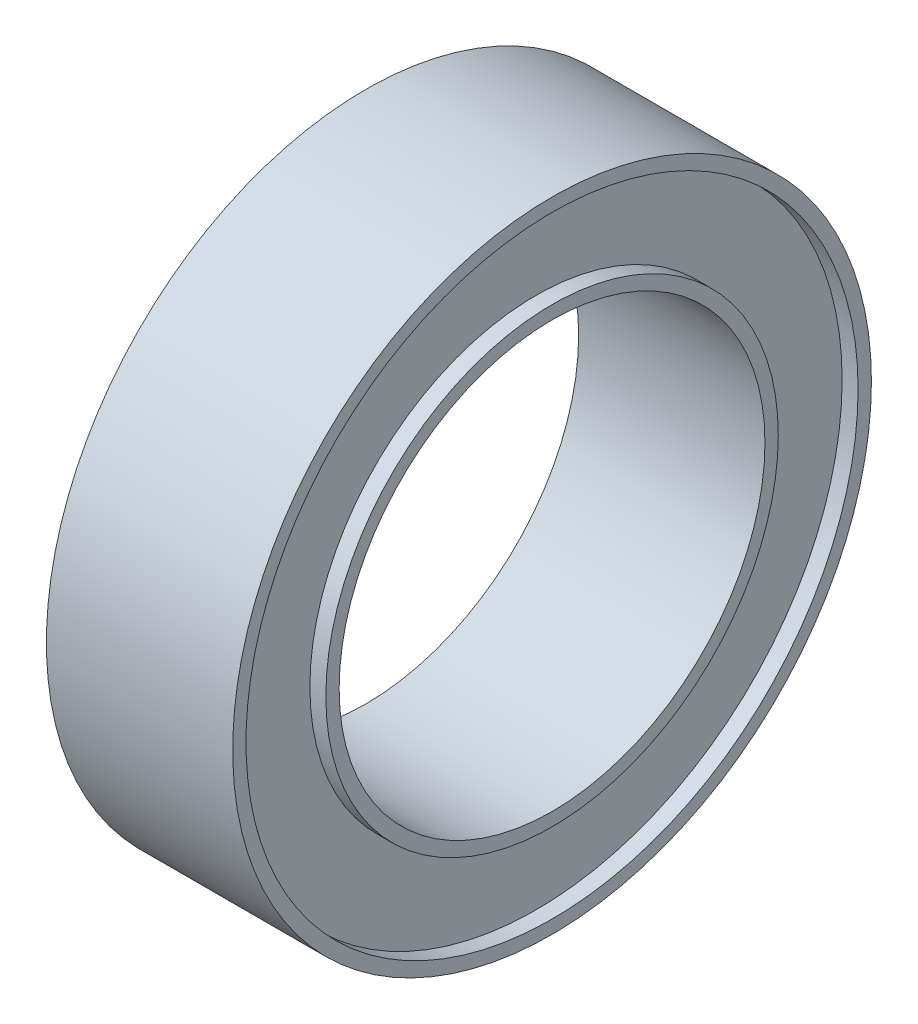
ISO-10303-21;
HEADER;
FILE_DESCRIPTION(('STEP AP214'),'2;1');
FILE_NAME('part.step','',(''),(''),'','','');
FILE_SCHEMA(('AUTOMOTIVE_DESIGN { 1 0 10303 214 1 1 1 1 }'));
ENDSEC;
DATA;
#1=APPLICATION_CONTEXT('core data for automotive mechanical design processes');
#2=APPLICATION_PROTOCOL_DEFINITION('international standard','automotive_design',2000,#1);
#3=PRODUCT_CONTEXT('',#1,'mechanical');
#4=PRODUCT('Part','Part','',(#3));
#5=PRODUCT_RELATED_PRODUCT_CATEGORY('part','',(#4));
#6=PRODUCT_DEFINITION_FORMATION('','',#4);
#7=PRODUCT_DEFINITION_CONTEXT('part definition',#1,'design');
#8=PRODUCT_DEFINITION('design','',#6,#7);
#9=PRODUCT_DEFINITION_SHAPE('','',#8);
#10=(LENGTH_UNIT() NAMED_UNIT(*) SI_UNIT(.MILLI.,.METRE.));
#11=(NAMED_UNIT(*) PLANE_ANGLE_UNIT() SI_UNIT($,.RADIAN.));
#12=(NAMED_UNIT(*) SI_UNIT($,.STERADIAN.) SOLID_ANGLE_UNIT());
#13=UNCERTAINTY_MEASURE_WITH_UNIT(LENGTH_MEASURE(1.E-05),#10,'distance_accuracy_value','');
#14=(GEOMETRIC_REPRESENTATION_CONTEXT(3) GLOBAL_UNCERTAINTY_ASSIGNED_CONTEXT((#13)) GLOBAL_UNIT_ASSIGNED_CONTEXT((#10,
#11,#12)) REPRESENTATION_CONTEXT('',''));
#15=CARTESIAN_POINT('',(0.,0.,0.));
#16=DIRECTION('',(0.,0.,1.));
#17=DIRECTION('',(1.,0.,0.));
#18=AXIS2_PLACEMENT_3D('',#15,#16,#17);
#19=CARTESIAN_POINT('',(-1.75,0.,0.));
#20=DIRECTION('',(1.,0.,0.));
#21=DIRECTION('',(0.,0.,-1.));
#22=AXIS2_PLACEMENT_3D('',#19,#20,#21);
#23=PLANE('',#22);
#24=CARTESIAN_POINT('',(-1.75,0.,0.));
#25=DIRECTION('',(1.,0.,0.));
#26=DIRECTION('',(0.,0.,-1.));
#27=AXIS2_PLACEMENT_3D('',#24,#25,#26);
#28=CIRCLE('',#27,4.);
#29=CARTESIAN_POINT('',(-1.75,0.,-4.));
#30=VERTEX_POINT('',#29);
#31=EDGE_CURVE('E44',#30,#30,#28,.F.);
#32=ORIENTED_EDGE('',*,*,#31,.F.);
#33=EDGE_LOOP('',(#32));
#34=FACE_BOUND('',#33,.T.);
#35=CARTESIAN_POINT('',(-1.75,0.,0.));
#36=DIRECTION('',(1.,0.,0.));
#37=DIRECTION('',(0.,0.,-1.));
#38=AXIS2_PLACEMENT_3D('',#35,#36,#37);
#39=CIRCLE('',#38,4.25);
#40=CARTESIAN_POINT('',(-1.75,0.,-4.25));
#41=VERTEX_POINT('',#40);
#42=EDGE_CURVE('E70',#41,#41,#39,.T.);
#43=ORIENTED_EDGE('',*,*,#42,.F.);
#44=EDGE_LOOP('',(#43));
#45=FACE_BOUND('',#44,.T.);
#46=ADVANCED_FACE('F33',(#34,#45),#23,.F.);
#47=CARTESIAN_POINT('',(1.75,0.,0.));
#48=DIRECTION('',(1.,0.,0.));
#49=DIRECTION('',(0.,0.,-1.));
#50=AXIS2_PLACEMENT_3D('',#47,#48,#49);
#51=PLANE('',#50);
#52=CARTESIAN_POINT('',(1.75,0.,0.));
#53=DIRECTION('',(1.,0.,0.));
#54=DIRECTION('',(0.,0.,-1.));
#55=AXIS2_PLACEMENT_3D('',#52,#53,#54);
#56=CIRCLE('',#55,4.);
#57=CARTESIAN_POINT('',(1.75,0.,-4.));
#58=VERTEX_POINT('',#57);
#59=EDGE_CURVE('E48',#58,#58,#56,.T.);
#60=ORIENTED_EDGE('',*,*,#59,.F.);
#61=EDGE_LOOP('',(#60));
#62=FACE_BOUND('',#61,.T.);
#63=CARTESIAN_POINT('',(1.75,0.,0.));
#64=DIRECTION('',(1.,0.,0.));
#65=DIRECTION('',(0.,0.,-1.));
#66=AXIS2_PLACEMENT_3D('',#63,#64,#65);
#67=CIRCLE('',#66,4.25);
#68=CARTESIAN_POINT('',(1.75,0.,-4.25));
#69=VERTEX_POINT('',#68);
#70=EDGE_CURVE('E58',#69,#69,#67,.T.);
#71=ORIENTED_EDGE('',*,*,#70,.T.);
#72=EDGE_LOOP('',(#71));
#73=FACE_BOUND('',#72,.T.);
#74=ADVANCED_FACE('F86',(#62,#73),#51,.T.);
#75=CARTESIAN_POINT('',(1.75,0.,0.));
#76=DIRECTION('',(-1.,0.,0.));
#77=DIRECTION('',(0.,0.,1.));
#78=AXIS2_PLACEMENT_3D('',#75,#76,#77);
#79=CYLINDRICAL_SURFACE('',#78,6.);
#80=CARTESIAN_POINT('',(1.75,0.,0.));
#81=DIRECTION('',(1.,0.,0.));
#82=DIRECTION('',(0.,0.,-1.));
#83=AXIS2_PLACEMENT_3D('',#80,#81,#82);
#84=CIRCLE('',#83,6.);
#85=CARTESIAN_POINT('',(1.75,0.,-6.));
#86=VERTEX_POINT('',#85);
#87=EDGE_CURVE('E10',#86,#86,#84,.T.);
#88=ORIENTED_EDGE('',*,*,#87,.F.);
#89=EDGE_LOOP('',(#88));
#90=FACE_BOUND('',#89,.T.);
#91=CARTESIAN_POINT('',(-1.75,0.,0.));
#92=DIRECTION('',(1.,0.,0.));
#93=DIRECTION('',(0.,0.,-1.));
#94=AXIS2_PLACEMENT_3D('',#91,#92,#93);
#95=CIRCLE('',#94,6.);
#96=CARTESIAN_POINT('',(-1.75,0.,-6.));
#97=VERTEX_POINT('',#96);
#98=EDGE_CURVE('E37',#97,#97,#95,.T.);
#99=ORIENTED_EDGE('',*,*,#98,.T.);
#100=EDGE_LOOP('',(#99));
#101=FACE_BOUND('',#100,.T.);
#102=ADVANCED_FACE('F35',(#90,#101),#79,.T.);
#103=CARTESIAN_POINT('',(1.75,0.,0.));
#104=DIRECTION('',(1.,0.,0.));
#105=DIRECTION('',(0.,0.,-1.));
#106=AXIS2_PLACEMENT_3D('',#103,#104,#105);
#107=CIRCLE('',#106,5.75);
#108=CARTESIAN_POINT('',(1.75,0.,-5.75));
#109=VERTEX_POINT('',#108);
#110=EDGE_CURVE('E52',#109,#109,#107,.T.);
#111=ORIENTED_EDGE('',*,*,#110,.F.);
#112=EDGE_LOOP('',(#111));
#113=FACE_BOUND('',#112,.T.);
#114=ORIENTED_EDGE('',*,*,#87,.T.);
#115=EDGE_LOOP('',(#114));
#116=FACE_BOUND('',#115,.T.);
#117=ADVANCED_FACE('F94',(#113,#116),#51,.T.);
#118=CARTESIAN_POINT('',(-1.75,0.,0.));
#119=DIRECTION('',(1.,0.,0.));
#120=DIRECTION('',(0.,0.,-1.));
#121=AXIS2_PLACEMENT_3D('',#118,#119,#120);
#122=CIRCLE('',#121,5.75);
#123=CARTESIAN_POINT('',(-1.75,0.,-5.75));
#124=VERTEX_POINT('',#123);
#125=EDGE_CURVE('E64',#124,#124,#122,.T.);
#126=ORIENTED_EDGE('',*,*,#125,.T.);
#127=EDGE_LOOP('',(#126));
#128=FACE_BOUND('',#127,.T.);
#129=ORIENTED_EDGE('',*,*,#98,.F.);
#130=EDGE_LOOP('',(#129));
#131=FACE_BOUND('',#130,.T.);
#132=ADVANCED_FACE('F88',(#128,#131),#23,.F.);
#133=CARTESIAN_POINT('',(-1.751,0.,0.));
#134=DIRECTION('',(1.,0.,0.));
#135=DIRECTION('',(0.,0.,-1.));
#136=AXIS2_PLACEMENT_3D('',#133,#134,#135);
#137=CYLINDRICAL_SURFACE('',#136,4.);
#138=ORIENTED_EDGE('',*,*,#59,.T.);
#139=EDGE_LOOP('',(#138));
#140=FACE_BOUND('',#139,.T.);
#141=ORIENTED_EDGE('',*,*,#31,.T.);
#142=EDGE_LOOP('',(#141));
#143=FACE_BOUND('',#142,.T.);
#144=ADVANCED_FACE('F97',(#140,#143),#137,.F.);
#145=CARTESIAN_POINT('',(1.45,0.,0.));
#146=DIRECTION('',(1.,0.,0.));
#147=DIRECTION('',(0.,0.,-1.));
#148=AXIS2_PLACEMENT_3D('',#145,#146,#147);
#149=CYLINDRICAL_SURFACE('',#148,5.75);
#150=CARTESIAN_POINT('',(1.45,0.,0.));
#151=DIRECTION('',(1.,0.,0.));
#152=DIRECTION('',(0.,0.,-1.));
#153=AXIS2_PLACEMENT_3D('',#150,#151,#152);
#154=CIRCLE('',#153,5.75);
#155=CARTESIAN_POINT('',(1.45,0.,-5.75));
#156=VERTEX_POINT('',#155);
#157=EDGE_CURVE('E51',#156,#156,#154,.T.);
#158=ORIENTED_EDGE('',*,*,#157,.F.);
#159=EDGE_LOOP('',(#158));
#160=FACE_BOUND('',#159,.T.);
#161=ORIENTED_EDGE('',*,*,#110,.T.);
#162=EDGE_LOOP('',(#161));
#163=FACE_BOUND('',#162,.T.);
#164=ADVANCED_FACE('F103',(#160,#163),#149,.F.);
#165=CARTESIAN_POINT('',(1.45,0.,0.));
#166=DIRECTION('',(1.,0.,0.));
#167=DIRECTION('',(0.,0.,-1.));
#168=AXIS2_PLACEMENT_3D('',#165,#166,#167);
#169=PLANE('',#168);
#170=CARTESIAN_POINT('',(1.45,0.,0.));
#171=DIRECTION('',(1.,0.,0.));
#172=DIRECTION('',(0.,0.,-1.));
#173=AXIS2_PLACEMENT_3D('',#170,#171,#172);
#174=CIRCLE('',#173,4.25);
#175=CARTESIAN_POINT('',(1.45,0.,-4.25));
#176=VERTEX_POINT('',#175);
#177=EDGE_CURVE('E55',#176,#176,#174,.T.);
#178=ORIENTED_EDGE('',*,*,#177,.F.);
#179=EDGE_LOOP('',(#178));
#180=FACE_BOUND('',#179,.T.);
#181=ORIENTED_EDGE('',*,*,#157,.T.);
#182=EDGE_LOOP('',(#181));
#183=FACE_BOUND('',#182,.T.);
#184=ADVANCED_FACE('F138',(#180,#183),#169,.T.);
#185=CARTESIAN_POINT('',(1.45,0.,0.));
#186=DIRECTION('',(1.,0.,0.));
#187=DIRECTION('',(0.,0.,-1.));
#188=AXIS2_PLACEMENT_3D('',#185,#186,#187);
#189=CYLINDRICAL_SURFACE('',#188,4.25);
#190=ORIENTED_EDGE('',*,*,#177,.T.);
#191=EDGE_LOOP('',(#190));
#192=FACE_BOUND('',#191,.T.);
#193=ORIENTED_EDGE('',*,*,#70,.F.);
#194=EDGE_LOOP('',(#193));
#195=FACE_BOUND('',#194,.T.);
#196=ADVANCED_FACE('F148',(#192,#195),#189,.T.);
#197=CARTESIAN_POINT('',(-1.45,0.,0.));
#198=DIRECTION('',(-1.,0.,0.));
#199=DIRECTION('',(0.,0.,-1.));
#200=AXIS2_PLACEMENT_3D('',#197,#198,#199);
#201=PLANE('',#200);
#202=CARTESIAN_POINT('',(-1.45,0.,0.));
#203=DIRECTION('',(1.,0.,0.));
#204=DIRECTION('',(0.,0.,-1.));
#205=AXIS2_PLACEMENT_3D('',#202,#203,#204);
#206=CIRCLE('',#205,5.75);
#207=CARTESIAN_POINT('',(-1.45,0.,-5.75));
#208=VERTEX_POINT('',#207);
#209=EDGE_CURVE('E61',#208,#208,#206,.T.);
#210=ORIENTED_EDGE('',*,*,#209,.F.);
#211=EDGE_LOOP('',(#210));
#212=FACE_BOUND('',#211,.T.);
#213=CARTESIAN_POINT('',(-1.45,0.,0.));
#214=DIRECTION('',(1.,0.,0.));
#215=DIRECTION('',(0.,0.,-1.));
#216=AXIS2_PLACEMENT_3D('',#213,#214,#215);
#217=CIRCLE('',#216,4.25);
#218=CARTESIAN_POINT('',(-1.45,0.,-4.25));
#219=VERTEX_POINT('',#218);
#220=EDGE_CURVE('E67',#219,#219,#217,.T.);
#221=ORIENTED_EDGE('',*,*,#220,.T.);
#222=EDGE_LOOP('',(#221));
#223=FACE_BOUND('',#222,.T.);
#224=ADVANCED_FACE('F76',(#212,#223),#201,.T.);
#225=CARTESIAN_POINT('',(-1.45,0.,0.));
#226=DIRECTION('',(-1.,0.,0.));
#227=DIRECTION('',(0.,0.,1.));
#228=AXIS2_PLACEMENT_3D('',#225,#226,#227);
#229=CYLINDRICAL_SURFACE('',#228,5.75);
#230=ORIENTED_EDGE('',*,*,#209,.T.);
#231=EDGE_LOOP('',(#230));
#232=FACE_BOUND('',#231,.T.);
#233=ORIENTED_EDGE('',*,*,#125,.F.);
#234=EDGE_LOOP('',(#233));
#235=FACE_BOUND('',#234,.T.);
#236=ADVANCED_FACE('F81',(#232,#235),#229,.F.);
#237=CARTESIAN_POINT('',(-1.45,0.,0.));
#238=DIRECTION('',(-1.,0.,0.));
#239=DIRECTION('',(0.,0.,1.));
#240=AXIS2_PLACEMENT_3D('',#237,#238,#239);
#241=CYLINDRICAL_SURFACE('',#240,4.25);
#242=ORIENTED_EDGE('',*,*,#220,.F.);
#243=EDGE_LOOP('',(#242));
#244=FACE_BOUND('',#243,.T.);
#245=ORIENTED_EDGE('',*,*,#42,.T.);
#246=EDGE_LOOP('',(#245));
#247=FACE_BOUND('',#246,.T.);
#248=ADVANCED_FACE('F78',(#244,#247),#241,.T.);
#249=CLOSED_SHELL('',(#46,#74,#102,#117,#132,#144,#164,#184,#196,#224,#236,#248));
#250=MANIFOLD_SOLID_BREP('B2',#249);
#251=ADVANCED_BREP_SHAPE_REPRESENTATION('',(#18,#250),#14);
#252=SHAPE_DEFINITION_REPRESENTATION(#9,#251);
ENDSEC;
END-ISO-10303-21;
